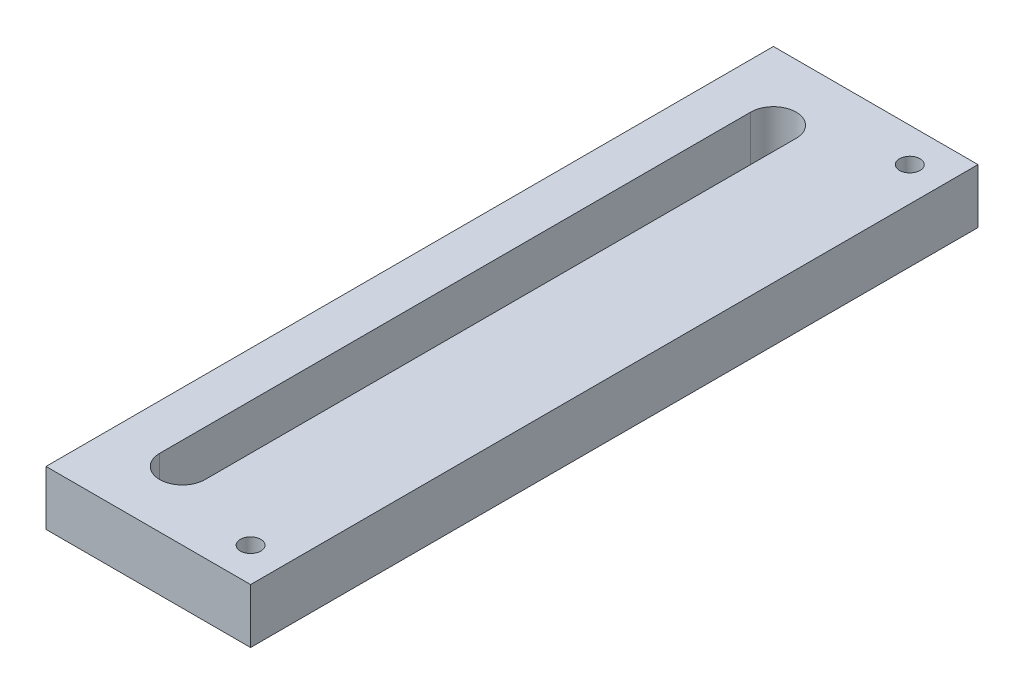
ISO-10303-21;
HEADER;
FILE_DESCRIPTION(('STEP AP214'),'2;1');
FILE_NAME('part.step','',(''),(''),'','','');
FILE_SCHEMA(('AUTOMOTIVE_DESIGN { 1 0 10303 214 1 1 1 1 }'));
ENDSEC;
DATA;
#1=APPLICATION_CONTEXT('core data for automotive mechanical design processes');
#2=APPLICATION_PROTOCOL_DEFINITION('international standard','automotive_design',2000,#1);
#3=PRODUCT_CONTEXT('',#1,'mechanical');
#4=PRODUCT('Part','Part','',(#3));
#5=PRODUCT_RELATED_PRODUCT_CATEGORY('part','',(#4));
#6=PRODUCT_DEFINITION_FORMATION('','',#4);
#7=PRODUCT_DEFINITION_CONTEXT('part definition',#1,'design');
#8=PRODUCT_DEFINITION('design','',#6,#7);
#9=PRODUCT_DEFINITION_SHAPE('','',#8);
#10=(LENGTH_UNIT() NAMED_UNIT(*) SI_UNIT(.MILLI.,.METRE.));
#11=(NAMED_UNIT(*) PLANE_ANGLE_UNIT() SI_UNIT($,.RADIAN.));
#12=(NAMED_UNIT(*) SI_UNIT($,.STERADIAN.) SOLID_ANGLE_UNIT());
#13=UNCERTAINTY_MEASURE_WITH_UNIT(LENGTH_MEASURE(1.E-05),#10,'distance_accuracy_value','');
#14=(GEOMETRIC_REPRESENTATION_CONTEXT(3) GLOBAL_UNCERTAINTY_ASSIGNED_CONTEXT((#13)) GLOBAL_UNIT_ASSIGNED_CONTEXT((#10,
#11,#12)) REPRESENTATION_CONTEXT('',''));
#15=CARTESIAN_POINT('',(0.,0.,0.));
#16=DIRECTION('',(0.,0.,1.));
#17=DIRECTION('',(1.,0.,0.));
#18=AXIS2_PLACEMENT_3D('',#15,#16,#17);
#19=CARTESIAN_POINT('',(0.,0.,0.));
#20=DIRECTION('',(0.,1.,0.));
#21=DIRECTION('',(0.,0.,1.));
#22=AXIS2_PLACEMENT_3D('',#19,#20,#21);
#23=PLANE('',#22);
#24=DIRECTION('',(0.,0.,1.));
#25=VECTOR('',#24,1.);
#26=CARTESIAN_POINT('',(-12.5,0.,65.));
#27=LINE('',#26,#25);
#28=CARTESIAN_POINT('',(-12.5,0.,-65.));
#29=VERTEX_POINT('',#28);
#30=CARTESIAN_POINT('',(-12.5,0.,65.));
#31=VERTEX_POINT('',#30);
#32=EDGE_CURVE('E115',#29,#31,#27,.T.);
#33=ORIENTED_EDGE('',*,*,#32,.T.);
#34=CARTESIAN_POINT('',(-7.49999999999999,0.,65.));
#35=DIRECTION('',(0.,1.,0.));
#36=DIRECTION('',(0.,0.,1.));
#37=AXIS2_PLACEMENT_3D('',#34,#35,#36);
#38=CIRCLE('',#37,5.);
#39=CARTESIAN_POINT('',(-2.49999999999999,0.,65.));
#40=VERTEX_POINT('',#39);
#41=EDGE_CURVE('E106',#31,#40,#38,.T.);
#42=ORIENTED_EDGE('',*,*,#41,.T.);
#43=DIRECTION('',(0.,0.,-1.));
#44=VECTOR('',#43,1.);
#45=CARTESIAN_POINT('',(-2.49999999999999,0.,65.));
#46=LINE('',#45,#44);
#47=CARTESIAN_POINT('',(-2.49999999999999,0.,-65.));
#48=VERTEX_POINT('',#47);
#49=EDGE_CURVE('E113',#40,#48,#46,.T.);
#50=ORIENTED_EDGE('',*,*,#49,.T.);
#51=CARTESIAN_POINT('',(-7.49999999999999,0.,-65.));
#52=DIRECTION('',(0.,1.,0.));
#53=DIRECTION('',(0.,0.,1.));
#54=AXIS2_PLACEMENT_3D('',#51,#52,#53);
#55=CIRCLE('',#54,5.00000000000001);
#56=EDGE_CURVE('E53',#48,#29,#55,.T.);
#57=ORIENTED_EDGE('',*,*,#56,.T.);
#58=EDGE_LOOP('',(#33,#42,#50,#57));
#59=FACE_BOUND('',#58,.T.);
#60=DIRECTION('',(0.,0.,1.));
#61=VECTOR('',#60,1.);
#62=CARTESIAN_POINT('',(-22.5,0.,80.0000000000001));
#63=LINE('',#62,#61);
#64=CARTESIAN_POINT('',(-22.5,0.,-79.9999999999999));
#65=VERTEX_POINT('',#64);
#66=CARTESIAN_POINT('',(-22.5,0.,80.0000000000001));
#67=VERTEX_POINT('',#66);
#68=EDGE_CURVE('E162',#65,#67,#63,.T.);
#69=ORIENTED_EDGE('',*,*,#68,.F.);
#70=DIRECTION('',(-1.,0.,0.));
#71=VECTOR('',#70,1.);
#72=CARTESIAN_POINT('',(22.5,0.,-79.9999999999999));
#73=LINE('',#72,#71);
#74=CARTESIAN_POINT('',(22.5,0.,-79.9999999999999));
#75=VERTEX_POINT('',#74);
#76=EDGE_CURVE('E169',#75,#65,#73,.T.);
#77=ORIENTED_EDGE('',*,*,#76,.F.);
#78=DIRECTION('',(0.,0.,-1.));
#79=VECTOR('',#78,1.);
#80=CARTESIAN_POINT('',(22.5,0.,80.0000000000001));
#81=LINE('',#80,#79);
#82=CARTESIAN_POINT('',(22.5,0.,80.0000000000001));
#83=VERTEX_POINT('',#82);
#84=EDGE_CURVE('E179',#83,#75,#81,.T.);
#85=ORIENTED_EDGE('',*,*,#84,.F.);
#86=DIRECTION('',(1.,0.,0.));
#87=VECTOR('',#86,1.);
#88=CARTESIAN_POINT('',(22.5,0.,80.0000000000001));
#89=LINE('',#88,#87);
#90=EDGE_CURVE('E180',#67,#83,#89,.T.);
#91=ORIENTED_EDGE('',*,*,#90,.F.);
#92=EDGE_LOOP('',(#69,#77,#85,#91));
#93=FACE_BOUND('',#92,.T.);
#94=CARTESIAN_POINT('',(15.,0.,-72.4999999999999));
#95=DIRECTION('',(0.,1.,0.));
#96=DIRECTION('',(0.,0.,1.));
#97=AXIS2_PLACEMENT_3D('',#94,#95,#96);
#98=CIRCLE('',#97,5.);
#99=CARTESIAN_POINT('',(15.,0.,-67.4999999999999));
#100=VERTEX_POINT('',#99);
#101=EDGE_CURVE('E149',#100,#100,#98,.T.);
#102=ORIENTED_EDGE('',*,*,#101,.T.);
#103=EDGE_LOOP('',(#102));
#104=FACE_BOUND('',#103,.T.);
#105=CARTESIAN_POINT('',(15.,0.,72.4999999999999));
#106=DIRECTION('',(0.,-1.,0.));
#107=DIRECTION('',(0.,0.,-1.));
#108=AXIS2_PLACEMENT_3D('',#105,#106,#107);
#109=CIRCLE('',#108,5.);
#110=CARTESIAN_POINT('',(15.,0.,67.4999999999999));
#111=VERTEX_POINT('',#110);
#112=EDGE_CURVE('E136',#111,#111,#109,.T.);
#113=ORIENTED_EDGE('',*,*,#112,.F.);
#114=EDGE_LOOP('',(#113));
#115=FACE_BOUND('',#114,.T.);
#116=ADVANCED_FACE('F39',(#59,#93,#104,#115),#23,.F.);
#117=CARTESIAN_POINT('',(-22.5,12.,80.0000000000001));
#118=DIRECTION('',(1.,0.,0.));
#119=DIRECTION('',(0.,0.,-1.));
#120=AXIS2_PLACEMENT_3D('',#117,#118,#119);
#121=PLANE('',#120);
#122=ORIENTED_EDGE('',*,*,#68,.T.);
#123=DIRECTION('',(0.,-1.,0.));
#124=VECTOR('',#123,1.);
#125=CARTESIAN_POINT('',(-22.5,12.,80.0000000000001));
#126=LINE('',#125,#124);
#127=CARTESIAN_POINT('',(-22.5,12.,80.0000000000001));
#128=VERTEX_POINT('',#127);
#129=EDGE_CURVE('E11',#128,#67,#126,.T.);
#130=ORIENTED_EDGE('',*,*,#129,.F.);
#131=DIRECTION('',(0.,0.,1.));
#132=VECTOR('',#131,1.);
#133=CARTESIAN_POINT('',(-22.5,12.,80.0000000000001));
#134=LINE('',#133,#132);
#135=CARTESIAN_POINT('',(-22.5,12.,-79.9999999999999));
#136=VERTEX_POINT('',#135);
#137=EDGE_CURVE('E163',#136,#128,#134,.T.);
#138=ORIENTED_EDGE('',*,*,#137,.F.);
#139=DIRECTION('',(0.,-1.,0.));
#140=VECTOR('',#139,1.);
#141=CARTESIAN_POINT('',(-22.5,12.,-79.9999999999999));
#142=LINE('',#141,#140);
#143=EDGE_CURVE('E173',#136,#65,#142,.T.);
#144=ORIENTED_EDGE('',*,*,#143,.T.);
#145=EDGE_LOOP('',(#122,#130,#138,#144));
#146=FACE_BOUND('',#145,.T.);
#147=ADVANCED_FACE('F41',(#146),#121,.F.);
#148=CARTESIAN_POINT('',(22.5,12.,80.0000000000001));
#149=DIRECTION('',(0.,0.,-1.));
#150=DIRECTION('',(-1.,0.,0.));
#151=AXIS2_PLACEMENT_3D('',#148,#149,#150);
#152=PLANE('',#151);
#153=ORIENTED_EDGE('',*,*,#90,.T.);
#154=DIRECTION('',(0.,-1.,0.));
#155=VECTOR('',#154,1.);
#156=CARTESIAN_POINT('',(22.5,12.,80.0000000000001));
#157=LINE('',#156,#155);
#158=CARTESIAN_POINT('',(22.5,12.,80.0000000000001));
#159=VERTEX_POINT('',#158);
#160=EDGE_CURVE('E50',#159,#83,#157,.T.);
#161=ORIENTED_EDGE('',*,*,#160,.F.);
#162=DIRECTION('',(1.,0.,0.));
#163=VECTOR('',#162,1.);
#164=CARTESIAN_POINT('',(22.5,12.,80.0000000000001));
#165=LINE('',#164,#163);
#166=EDGE_CURVE('E170',#128,#159,#165,.T.);
#167=ORIENTED_EDGE('',*,*,#166,.F.);
#168=ORIENTED_EDGE('',*,*,#129,.T.);
#169=EDGE_LOOP('',(#153,#161,#167,#168));
#170=FACE_BOUND('',#169,.T.);
#171=ADVANCED_FACE('F206',(#170),#152,.F.);
#172=CARTESIAN_POINT('',(22.5,12.,80.0000000000001));
#173=DIRECTION('',(-1.,0.,0.));
#174=DIRECTION('',(0.,0.,1.));
#175=AXIS2_PLACEMENT_3D('',#172,#173,#174);
#176=PLANE('',#175);
#177=ORIENTED_EDGE('',*,*,#84,.T.);
#178=DIRECTION('',(0.,-1.,0.));
#179=VECTOR('',#178,1.);
#180=CARTESIAN_POINT('',(22.5,12.,-79.9999999999999));
#181=LINE('',#180,#179);
#182=CARTESIAN_POINT('',(22.5,12.,-79.9999999999999));
#183=VERTEX_POINT('',#182);
#184=EDGE_CURVE('E184',#183,#75,#181,.T.);
#185=ORIENTED_EDGE('',*,*,#184,.F.);
#186=DIRECTION('',(0.,0.,-1.));
#187=VECTOR('',#186,1.);
#188=CARTESIAN_POINT('',(22.5,12.,80.0000000000001));
#189=LINE('',#188,#187);
#190=EDGE_CURVE('E168',#159,#183,#189,.T.);
#191=ORIENTED_EDGE('',*,*,#190,.F.);
#192=ORIENTED_EDGE('',*,*,#160,.T.);
#193=EDGE_LOOP('',(#177,#185,#191,#192));
#194=FACE_BOUND('',#193,.T.);
#195=ADVANCED_FACE('F192',(#194),#176,.F.);
#196=CARTESIAN_POINT('',(22.5,12.,-79.9999999999999));
#197=DIRECTION('',(0.,0.,1.));
#198=DIRECTION('',(1.,0.,0.));
#199=AXIS2_PLACEMENT_3D('',#196,#197,#198);
#200=PLANE('',#199);
#201=ORIENTED_EDGE('',*,*,#76,.T.);
#202=ORIENTED_EDGE('',*,*,#143,.F.);
#203=DIRECTION('',(-1.,0.,0.));
#204=VECTOR('',#203,1.);
#205=CARTESIAN_POINT('',(22.5,12.,-79.9999999999999));
#206=LINE('',#205,#204);
#207=EDGE_CURVE('E175',#183,#136,#206,.T.);
#208=ORIENTED_EDGE('',*,*,#207,.F.);
#209=ORIENTED_EDGE('',*,*,#184,.T.);
#210=EDGE_LOOP('',(#201,#202,#208,#209));
#211=FACE_BOUND('',#210,.T.);
#212=ADVANCED_FACE('F200',(#211),#200,.F.);
#213=CARTESIAN_POINT('',(0.,12.,0.));
#214=DIRECTION('',(0.,1.,0.));
#215=DIRECTION('',(0.,0.,1.));
#216=AXIS2_PLACEMENT_3D('',#213,#214,#215);
#217=PLANE('',#216);
#218=CARTESIAN_POINT('',(-7.49999999999999,12.,65.));
#219=DIRECTION('',(0.,1.,0.));
#220=DIRECTION('',(0.,0.,1.));
#221=AXIS2_PLACEMENT_3D('',#218,#219,#220);
#222=CIRCLE('',#221,5.);
#223=CARTESIAN_POINT('',(-12.5,12.,65.));
#224=VERTEX_POINT('',#223);
#225=CARTESIAN_POINT('',(-2.49999999999999,12.,65.));
#226=VERTEX_POINT('',#225);
#227=EDGE_CURVE('E65',#224,#226,#222,.T.);
#228=ORIENTED_EDGE('',*,*,#227,.F.);
#229=DIRECTION('',(0.,0.,1.));
#230=VECTOR('',#229,1.);
#231=CARTESIAN_POINT('',(-12.5,12.,65.));
#232=LINE('',#231,#230);
#233=CARTESIAN_POINT('',(-12.5,12.,-65.));
#234=VERTEX_POINT('',#233);
#235=EDGE_CURVE('E122',#234,#224,#232,.T.);
#236=ORIENTED_EDGE('',*,*,#235,.F.);
#237=CARTESIAN_POINT('',(-7.49999999999999,12.,-65.));
#238=DIRECTION('',(0.,1.,0.));
#239=DIRECTION('',(0.,0.,1.));
#240=AXIS2_PLACEMENT_3D('',#237,#238,#239);
#241=CIRCLE('',#240,5.00000000000001);
#242=CARTESIAN_POINT('',(-2.49999999999998,12.,-65.));
#243=VERTEX_POINT('',#242);
#244=EDGE_CURVE('E124',#243,#234,#241,.T.);
#245=ORIENTED_EDGE('',*,*,#244,.F.);
#246=DIRECTION('',(0.,0.,-1.));
#247=VECTOR('',#246,1.);
#248=CARTESIAN_POINT('',(-2.49999999999999,12.,65.));
#249=LINE('',#248,#247);
#250=EDGE_CURVE('E128',#226,#243,#249,.T.);
#251=ORIENTED_EDGE('',*,*,#250,.F.);
#252=EDGE_LOOP('',(#228,#236,#245,#251));
#253=FACE_BOUND('',#252,.T.);
#254=CARTESIAN_POINT('',(15.,12.,72.5000000000001));
#255=DIRECTION('',(0.,1.,0.));
#256=DIRECTION('',(0.,0.,1.));
#257=AXIS2_PLACEMENT_3D('',#254,#255,#256);
#258=CIRCLE('',#257,2.25);
#259=CARTESIAN_POINT('',(15.,12.,74.7500000000001));
#260=VERTEX_POINT('',#259);
#261=EDGE_CURVE('E160',#260,#260,#258,.T.);
#262=ORIENTED_EDGE('',*,*,#261,.F.);
#263=EDGE_LOOP('',(#262));
#264=FACE_BOUND('',#263,.T.);
#265=CARTESIAN_POINT('',(15.,12.,-72.4999999999999));
#266=DIRECTION('',(0.,1.,0.));
#267=DIRECTION('',(0.,0.,1.));
#268=AXIS2_PLACEMENT_3D('',#265,#266,#267);
#269=CIRCLE('',#268,2.25);
#270=CARTESIAN_POINT('',(15.,12.,-70.2499999999999));
#271=VERTEX_POINT('',#270);
#272=EDGE_CURVE('E159',#271,#271,#269,.T.);
#273=ORIENTED_EDGE('',*,*,#272,.F.);
#274=EDGE_LOOP('',(#273));
#275=FACE_BOUND('',#274,.T.);
#276=ORIENTED_EDGE('',*,*,#137,.T.);
#277=ORIENTED_EDGE('',*,*,#166,.T.);
#278=ORIENTED_EDGE('',*,*,#190,.T.);
#279=ORIENTED_EDGE('',*,*,#207,.T.);
#280=EDGE_LOOP('',(#276,#277,#278,#279));
#281=FACE_BOUND('',#280,.T.);
#282=ADVANCED_FACE('F202',(#253,#264,#275,#281),#217,.T.);
#283=CARTESIAN_POINT('',(15.,7.,-72.4999999999999));
#284=DIRECTION('',(0.,1.,0.));
#285=DIRECTION('',(0.,0.,1.));
#286=AXIS2_PLACEMENT_3D('',#283,#284,#285);
#287=CYLINDRICAL_SURFACE('',#286,2.25);
#288=CARTESIAN_POINT('',(15.,7.,-72.4999999999999));
#289=DIRECTION('',(0.,1.,0.));
#290=DIRECTION('',(0.,0.,1.));
#291=AXIS2_PLACEMENT_3D('',#288,#289,#290);
#292=CIRCLE('',#291,2.25);
#293=CARTESIAN_POINT('',(15.,7.,-70.2499999999999));
#294=VERTEX_POINT('',#293);
#295=EDGE_CURVE('E155',#294,#294,#292,.F.);
#296=ORIENTED_EDGE('',*,*,#295,.T.);
#297=EDGE_LOOP('',(#296));
#298=FACE_BOUND('',#297,.T.);
#299=ORIENTED_EDGE('',*,*,#272,.T.);
#300=EDGE_LOOP('',(#299));
#301=FACE_BOUND('',#300,.T.);
#302=ADVANCED_FACE('F226',(#298,#301),#287,.F.);
#303=CARTESIAN_POINT('',(15.,7.,72.5000000000001));
#304=DIRECTION('',(0.,1.,0.));
#305=DIRECTION('',(0.,0.,1.));
#306=AXIS2_PLACEMENT_3D('',#303,#304,#305);
#307=CYLINDRICAL_SURFACE('',#306,2.25);
#308=CARTESIAN_POINT('',(15.,7.,72.5000000000001));
#309=DIRECTION('',(0.,1.,0.));
#310=DIRECTION('',(0.,0.,1.));
#311=AXIS2_PLACEMENT_3D('',#308,#309,#310);
#312=CIRCLE('',#311,2.25);
#313=CARTESIAN_POINT('',(15.,7.,74.7500000000001));
#314=VERTEX_POINT('',#313);
#315=EDGE_CURVE('E141',#314,#314,#312,.F.);
#316=ORIENTED_EDGE('',*,*,#315,.T.);
#317=EDGE_LOOP('',(#316));
#318=FACE_BOUND('',#317,.T.);
#319=ORIENTED_EDGE('',*,*,#261,.T.);
#320=EDGE_LOOP('',(#319));
#321=FACE_BOUND('',#320,.T.);
#322=ADVANCED_FACE('F232',(#318,#321),#307,.F.);
#323=CARTESIAN_POINT('',(15.,7.,-72.4999999999999));
#324=DIRECTION('',(0.,1.,0.));
#325=DIRECTION('',(0.,0.,1.));
#326=AXIS2_PLACEMENT_3D('',#323,#324,#325);
#327=PLANE('',#326);
#328=CARTESIAN_POINT('',(15.,7.,-72.4999999999999));
#329=DIRECTION('',(0.,1.,0.));
#330=DIRECTION('',(0.,0.,1.));
#331=AXIS2_PLACEMENT_3D('',#328,#329,#330);
#332=CIRCLE('',#331,5.);
#333=CARTESIAN_POINT('',(15.,7.,-67.4999999999999));
#334=VERTEX_POINT('',#333);
#335=EDGE_CURVE('E146',#334,#334,#332,.T.);
#336=ORIENTED_EDGE('',*,*,#335,.F.);
#337=EDGE_LOOP('',(#336));
#338=FACE_BOUND('',#337,.T.);
#339=ORIENTED_EDGE('',*,*,#295,.F.);
#340=EDGE_LOOP('',(#339));
#341=FACE_BOUND('',#340,.T.);
#342=ADVANCED_FACE('F241',(#338,#341),#327,.F.);
#343=CARTESIAN_POINT('',(15.,0.,-72.4999999999999));
#344=DIRECTION('',(0.,1.,0.));
#345=DIRECTION('',(0.,0.,1.));
#346=AXIS2_PLACEMENT_3D('',#343,#344,#345);
#347=CYLINDRICAL_SURFACE('',#346,5.);
#348=ORIENTED_EDGE('',*,*,#101,.F.);
#349=EDGE_LOOP('',(#348));
#350=FACE_BOUND('',#349,.T.);
#351=ORIENTED_EDGE('',*,*,#335,.T.);
#352=EDGE_LOOP('',(#351));
#353=FACE_BOUND('',#352,.T.);
#354=ADVANCED_FACE('F250',(#350,#353),#347,.F.);
#355=CARTESIAN_POINT('',(15.,7.,72.4999999999999));
#356=DIRECTION('',(0.,1.,0.));
#357=DIRECTION('',(0.,0.,-1.));
#358=AXIS2_PLACEMENT_3D('',#355,#356,#357);
#359=PLANE('',#358);
#360=CARTESIAN_POINT('',(15.,7.,72.4999999999999));
#361=DIRECTION('',(0.,-1.,0.));
#362=DIRECTION('',(0.,0.,-1.));
#363=AXIS2_PLACEMENT_3D('',#360,#361,#362);
#364=CIRCLE('',#363,5.);
#365=CARTESIAN_POINT('',(15.,7.,67.4999999999999));
#366=VERTEX_POINT('',#365);
#367=EDGE_CURVE('E137',#366,#366,#364,.T.);
#368=ORIENTED_EDGE('',*,*,#367,.T.);
#369=EDGE_LOOP('',(#368));
#370=FACE_BOUND('',#369,.T.);
#371=ORIENTED_EDGE('',*,*,#315,.F.);
#372=EDGE_LOOP('',(#371));
#373=FACE_BOUND('',#372,.T.);
#374=ADVANCED_FACE('F252',(#370,#373),#359,.F.);
#375=CARTESIAN_POINT('',(15.,0.,72.4999999999999));
#376=DIRECTION('',(0.,1.,0.));
#377=DIRECTION('',(0.,0.,1.));
#378=AXIS2_PLACEMENT_3D('',#375,#376,#377);
#379=CYLINDRICAL_SURFACE('',#378,5.);
#380=ORIENTED_EDGE('',*,*,#112,.T.);
#381=EDGE_LOOP('',(#380));
#382=FACE_BOUND('',#381,.T.);
#383=ORIENTED_EDGE('',*,*,#367,.F.);
#384=EDGE_LOOP('',(#383));
#385=FACE_BOUND('',#384,.T.);
#386=ADVANCED_FACE('F254',(#382,#385),#379,.F.);
#387=CARTESIAN_POINT('',(-7.49999999999999,0.,65.));
#388=DIRECTION('',(0.,1.,0.));
#389=DIRECTION('',(0.,0.,1.));
#390=AXIS2_PLACEMENT_3D('',#387,#388,#389);
#391=CYLINDRICAL_SURFACE('',#390,5.);
#392=ORIENTED_EDGE('',*,*,#227,.T.);
#393=DIRECTION('',(0.,1.,0.));
#394=VECTOR('',#393,1.);
#395=CARTESIAN_POINT('',(-2.49999999999999,0.,65.));
#396=LINE('',#395,#394);
#397=EDGE_CURVE('E105',#40,#226,#396,.T.);
#398=ORIENTED_EDGE('',*,*,#397,.F.);
#399=ORIENTED_EDGE('',*,*,#41,.F.);
#400=DIRECTION('',(0.,1.,0.));
#401=VECTOR('',#400,1.);
#402=CARTESIAN_POINT('',(-12.5,0.,65.));
#403=LINE('',#402,#401);
#404=EDGE_CURVE('E133',#31,#224,#403,.T.);
#405=ORIENTED_EDGE('',*,*,#404,.T.);
#406=EDGE_LOOP('',(#392,#398,#399,#405));
#407=FACE_BOUND('',#406,.T.);
#408=ADVANCED_FACE('F102',(#407),#391,.F.);
#409=CARTESIAN_POINT('',(-12.5,0.,65.));
#410=DIRECTION('',(-1.,0.,0.));
#411=DIRECTION('',(0.,0.,1.));
#412=AXIS2_PLACEMENT_3D('',#409,#410,#411);
#413=PLANE('',#412);
#414=ORIENTED_EDGE('',*,*,#235,.T.);
#415=ORIENTED_EDGE('',*,*,#404,.F.);
#416=ORIENTED_EDGE('',*,*,#32,.F.);
#417=DIRECTION('',(0.,1.,0.));
#418=VECTOR('',#417,1.);
#419=CARTESIAN_POINT('',(-12.5,0.,-65.));
#420=LINE('',#419,#418);
#421=EDGE_CURVE('E140',#29,#234,#420,.T.);
#422=ORIENTED_EDGE('',*,*,#421,.T.);
#423=EDGE_LOOP('',(#414,#415,#416,#422));
#424=FACE_BOUND('',#423,.T.);
#425=ADVANCED_FACE('F265',(#424),#413,.F.);
#426=CARTESIAN_POINT('',(-7.49999999999999,0.,-65.));
#427=DIRECTION('',(0.,1.,0.));
#428=DIRECTION('',(0.,0.,1.));
#429=AXIS2_PLACEMENT_3D('',#426,#427,#428);
#430=CYLINDRICAL_SURFACE('',#429,5.00000000000001);
#431=ORIENTED_EDGE('',*,*,#244,.T.);
#432=ORIENTED_EDGE('',*,*,#421,.F.);
#433=ORIENTED_EDGE('',*,*,#56,.F.);
#434=DIRECTION('',(0.,1.,0.));
#435=VECTOR('',#434,1.);
#436=CARTESIAN_POINT('',(-2.49999999999998,0.,-65.));
#437=LINE('',#436,#435);
#438=EDGE_CURVE('E112',#48,#243,#437,.T.);
#439=ORIENTED_EDGE('',*,*,#438,.T.);
#440=EDGE_LOOP('',(#431,#432,#433,#439));
#441=FACE_BOUND('',#440,.T.);
#442=ADVANCED_FACE('F264',(#441),#430,.F.);
#443=CARTESIAN_POINT('',(-2.49999999999999,0.,65.));
#444=DIRECTION('',(1.,0.,0.));
#445=DIRECTION('',(0.,0.,-1.));
#446=AXIS2_PLACEMENT_3D('',#443,#444,#445);
#447=PLANE('',#446);
#448=ORIENTED_EDGE('',*,*,#250,.T.);
#449=ORIENTED_EDGE('',*,*,#438,.F.);
#450=ORIENTED_EDGE('',*,*,#49,.F.);
#451=ORIENTED_EDGE('',*,*,#397,.T.);
#452=EDGE_LOOP('',(#448,#449,#450,#451));
#453=FACE_BOUND('',#452,.T.);
#454=ADVANCED_FACE('F116',(#453),#447,.F.);
#455=CLOSED_SHELL('',(#116,#147,#171,#195,#212,#282,#302,#322,#342,#354,#374,#386,#408,#425,
#442,#454));
#456=MANIFOLD_SOLID_BREP('B2',#455);
#457=ADVANCED_BREP_SHAPE_REPRESENTATION('',(#18,#456),#14);
#458=SHAPE_DEFINITION_REPRESENTATION(#9,#457);
ENDSEC;
END-ISO-10303-21;
